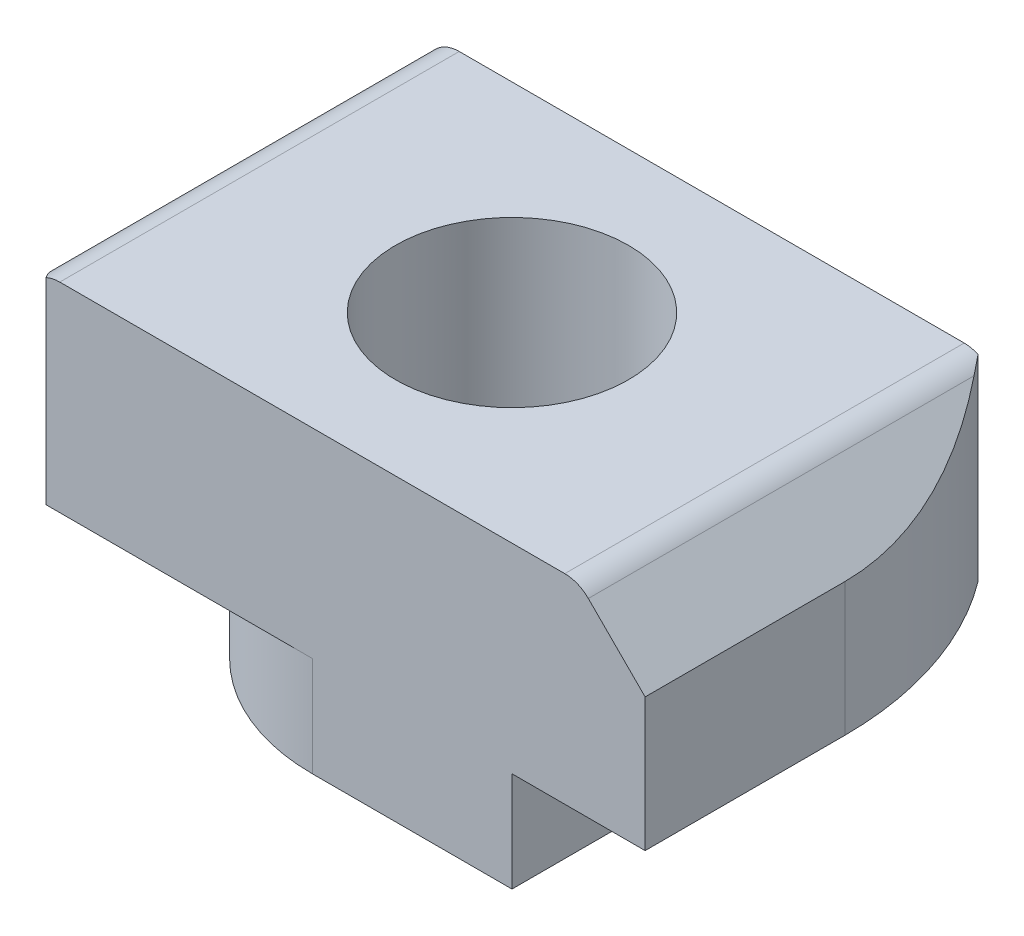
ISO-10303-21;
HEADER;
FILE_DESCRIPTION(('STEP AP214'),'2;1');
FILE_NAME('part.step','',(''),(''),'','','');
FILE_SCHEMA(('AUTOMOTIVE_DESIGN { 1 0 10303 214 1 1 1 1 }'));
ENDSEC;
DATA;
#1=APPLICATION_CONTEXT('core data for automotive mechanical design processes');
#2=APPLICATION_PROTOCOL_DEFINITION('international standard','automotive_design',2000,#1);
#3=PRODUCT_CONTEXT('',#1,'mechanical');
#4=PRODUCT('Part','Part','',(#3));
#5=PRODUCT_RELATED_PRODUCT_CATEGORY('part','',(#4));
#6=PRODUCT_DEFINITION_FORMATION('','',#4);
#7=PRODUCT_DEFINITION_CONTEXT('part definition',#1,'design');
#8=PRODUCT_DEFINITION('design','',#6,#7);
#9=PRODUCT_DEFINITION_SHAPE('','',#8);
#10=(LENGTH_UNIT() NAMED_UNIT(*) SI_UNIT(.MILLI.,.METRE.));
#11=(NAMED_UNIT(*) PLANE_ANGLE_UNIT() SI_UNIT($,.RADIAN.));
#12=(NAMED_UNIT(*) SI_UNIT($,.STERADIAN.) SOLID_ANGLE_UNIT());
#13=UNCERTAINTY_MEASURE_WITH_UNIT(LENGTH_MEASURE(1.E-05),#10,'distance_accuracy_value','');
#14=(GEOMETRIC_REPRESENTATION_CONTEXT(3) GLOBAL_UNCERTAINTY_ASSIGNED_CONTEXT((#13)) GLOBAL_UNIT_ASSIGNED_CONTEXT((#10,
#11,#12)) REPRESENTATION_CONTEXT('',''));
#15=CARTESIAN_POINT('',(0.,0.,0.));
#16=DIRECTION('',(0.,0.,1.));
#17=DIRECTION('',(1.,0.,0.));
#18=AXIS2_PLACEMENT_3D('',#15,#16,#17);
#19=CARTESIAN_POINT('',(0.,0.,-3.));
#20=DIRECTION('',(0.,-1.,0.));
#21=DIRECTION('',(0.,0.,-1.));
#22=AXIS2_PLACEMENT_3D('',#19,#20,#21);
#23=PLANE('',#22);
#24=DIRECTION('',(1.,0.,0.));
#25=VECTOR('',#24,1.);
#26=CARTESIAN_POINT('',(0.,0.,3.));
#27=LINE('',#26,#25);
#28=CARTESIAN_POINT('',(-4.,0.,3.));
#29=VERTEX_POINT('',#28);
#30=CARTESIAN_POINT('',(0.,0.,3.));
#31=VERTEX_POINT('',#30);
#32=EDGE_CURVE('E164',#29,#31,#27,.T.);
#33=ORIENTED_EDGE('',*,*,#32,.F.);
#34=CARTESIAN_POINT('',(0.,0.,0.));
#35=DIRECTION('',(0.,-1.,0.));
#36=DIRECTION('',(0.,0.,-1.));
#37=AXIS2_PLACEMENT_3D('',#34,#35,#36);
#38=CIRCLE('',#37,5.);
#39=CARTESIAN_POINT('',(-5.,0.,0.));
#40=VERTEX_POINT('',#39);
#41=EDGE_CURVE('E149',#29,#40,#38,.T.);
#42=ORIENTED_EDGE('',*,*,#41,.T.);
#43=DIRECTION('',(0.,0.,1.));
#44=VECTOR('',#43,1.);
#45=CARTESIAN_POINT('',(-5.,0.,-3.));
#46=LINE('',#45,#44);
#47=CARTESIAN_POINT('',(-5.,0.,-3.));
#48=VERTEX_POINT('',#47);
#49=EDGE_CURVE('E161',#48,#40,#46,.T.);
#50=ORIENTED_EDGE('',*,*,#49,.F.);
#51=DIRECTION('',(1.,0.,0.));
#52=VECTOR('',#51,1.);
#53=CARTESIAN_POINT('',(0.,0.,-3.));
#54=LINE('',#53,#52);
#55=CARTESIAN_POINT('',(-3.,0.,-3.));
#56=VERTEX_POINT('',#55);
#57=EDGE_CURVE('E187',#48,#56,#54,.T.);
#58=ORIENTED_EDGE('',*,*,#57,.T.);
#59=DIRECTION('',(0.,0.,-1.));
#60=VECTOR('',#59,1.);
#61=CARTESIAN_POINT('',(-3.,0.,-3.));
#62=LINE('',#61,#60);
#63=CARTESIAN_POINT('',(-3.,0.,0.));
#64=VERTEX_POINT('',#63);
#65=EDGE_CURVE('E305',#64,#56,#62,.T.);
#66=ORIENTED_EDGE('',*,*,#65,.F.);
#67=CARTESIAN_POINT('',(0.,0.,0.));
#68=DIRECTION('',(0.,-1.,0.));
#69=DIRECTION('',(0.,0.,-1.));
#70=AXIS2_PLACEMENT_3D('',#67,#68,#69);
#71=CIRCLE('',#70,3.);
#72=EDGE_CURVE('E321',#31,#64,#71,.T.);
#73=ORIENTED_EDGE('',*,*,#72,.F.);
#74=EDGE_LOOP('',(#33,#42,#50,#58,#66,#73));
#75=FACE_BOUND('',#74,.T.);
#76=ADVANCED_FACE('F35',(#75),#23,.T.);
#77=CARTESIAN_POINT('',(4.,3.,-3.));
#78=DIRECTION('',(0.707106781186548,0.707106781186547,0.));
#79=DIRECTION('',(-0.707106781186547,0.707106781186548,0.));
#80=AXIS2_PLACEMENT_3D('',#77,#78,#79);
#81=PLANE('',#80);
#82=CARTESIAN_POINT('',(0.,7.00000000000001,0.));
#83=DIRECTION('',(0.707106781186548,0.707106781186547,0.));
#84=DIRECTION('',(0.707106781186547,-0.707106781186548,0.));
#85=AXIS2_PLACEMENT_3D('',#82,#83,#84);
#86=ELLIPSE('',#85,7.07106781186548,5.);
#87=CARTESIAN_POINT('',(5.,2.,0.));
#88=VERTEX_POINT('',#87);
#89=CARTESIAN_POINT('',(4.14644660940673,2.85355339059327,-2.79409744199079));
#90=VERTEX_POINT('',#89);
#91=EDGE_CURVE('E292',#88,#90,#86,.T.);
#92=ORIENTED_EDGE('',*,*,#91,.T.);
#93=DIRECTION('',(0.,0.,1.));
#94=VECTOR('',#93,1.);
#95=CARTESIAN_POINT('',(4.14644660940673,2.85355339059327,-3.));
#96=LINE('',#95,#94);
#97=CARTESIAN_POINT('',(4.14644660940673,2.85355339059327,3.));
#98=VERTEX_POINT('',#97);
#99=EDGE_CURVE('E199',#90,#98,#96,.T.);
#100=ORIENTED_EDGE('',*,*,#99,.T.);
#101=DIRECTION('',(-0.707106781186547,0.707106781186548,0.));
#102=VECTOR('',#101,1.);
#103=CARTESIAN_POINT('',(4.,3.,3.));
#104=LINE('',#103,#102);
#105=CARTESIAN_POINT('',(5.,2.,3.));
#106=VERTEX_POINT('',#105);
#107=EDGE_CURVE('E180',#106,#98,#104,.T.);
#108=ORIENTED_EDGE('',*,*,#107,.F.);
#109=DIRECTION('',(0.,0.,1.));
#110=VECTOR('',#109,1.);
#111=CARTESIAN_POINT('',(5.,2.,-3.));
#112=LINE('',#111,#110);
#113=EDGE_CURVE('E193',#88,#106,#112,.T.);
#114=ORIENTED_EDGE('',*,*,#113,.F.);
#115=EDGE_LOOP('',(#92,#100,#108,#114));
#116=FACE_BOUND('',#115,.T.);
#117=ADVANCED_FACE('F234',(#116),#81,.T.);
#118=CARTESIAN_POINT('',(5.,0.,-3.));
#119=DIRECTION('',(1.,0.,0.));
#120=DIRECTION('',(0.,0.,-1.));
#121=AXIS2_PLACEMENT_3D('',#118,#119,#120);
#122=PLANE('',#121);
#123=DIRECTION('',(0.,0.,1.));
#124=VECTOR('',#123,1.);
#125=CARTESIAN_POINT('',(5.,0.,-3.));
#126=LINE('',#125,#124);
#127=CARTESIAN_POINT('',(5.,0.,0.));
#128=VERTEX_POINT('',#127);
#129=CARTESIAN_POINT('',(5.,0.,3.));
#130=VERTEX_POINT('',#129);
#131=EDGE_CURVE('E192',#128,#130,#126,.T.);
#132=ORIENTED_EDGE('',*,*,#131,.F.);
#133=DIRECTION('',(0.,-1.,0.));
#134=VECTOR('',#133,1.);
#135=CARTESIAN_POINT('',(5.,3.,0.));
#136=LINE('',#135,#134);
#137=EDGE_CURVE('E360',#88,#128,#136,.T.);
#138=ORIENTED_EDGE('',*,*,#137,.F.);
#139=ORIENTED_EDGE('',*,*,#113,.T.);
#140=DIRECTION('',(0.,1.,0.));
#141=VECTOR('',#140,1.);
#142=CARTESIAN_POINT('',(5.,0.,3.));
#143=LINE('',#142,#141);
#144=EDGE_CURVE('E177',#130,#106,#143,.T.);
#145=ORIENTED_EDGE('',*,*,#144,.F.);
#146=EDGE_LOOP('',(#132,#138,#139,#145));
#147=FACE_BOUND('',#146,.T.);
#148=ADVANCED_FACE('F236',(#147),#122,.T.);
#149=CARTESIAN_POINT('',(0.,0.,-3.));
#150=VERTEX_POINT('',#149);
#151=CARTESIAN_POINT('',(4.,0.,-3.));
#152=VERTEX_POINT('',#151);
#153=EDGE_CURVE('E186',#150,#152,#54,.T.);
#154=ORIENTED_EDGE('',*,*,#153,.T.);
#155=CARTESIAN_POINT('',(0.,0.,0.));
#156=DIRECTION('',(0.,-1.,0.));
#157=DIRECTION('',(0.,0.,-1.));
#158=AXIS2_PLACEMENT_3D('',#155,#156,#157);
#159=CIRCLE('',#158,5.);
#160=EDGE_CURVE('E156',#152,#128,#159,.T.);
#161=ORIENTED_EDGE('',*,*,#160,.T.);
#162=ORIENTED_EDGE('',*,*,#131,.T.);
#163=CARTESIAN_POINT('',(3.,0.,3.));
#164=VERTEX_POINT('',#163);
#165=EDGE_CURVE('E168',#164,#130,#27,.T.);
#166=ORIENTED_EDGE('',*,*,#165,.F.);
#167=DIRECTION('',(0.,0.,1.));
#168=VECTOR('',#167,1.);
#169=CARTESIAN_POINT('',(3.,0.,3.));
#170=LINE('',#169,#168);
#171=CARTESIAN_POINT('',(3.,0.,0.));
#172=VERTEX_POINT('',#171);
#173=EDGE_CURVE('E318',#172,#164,#170,.T.);
#174=ORIENTED_EDGE('',*,*,#173,.F.);
#175=CARTESIAN_POINT('',(0.,0.,0.));
#176=DIRECTION('',(0.,-1.,0.));
#177=DIRECTION('',(0.,0.,-1.));
#178=AXIS2_PLACEMENT_3D('',#175,#176,#177);
#179=CIRCLE('',#178,3.);
#180=EDGE_CURVE('E294',#150,#172,#179,.T.);
#181=ORIENTED_EDGE('',*,*,#180,.F.);
#182=EDGE_LOOP('',(#154,#161,#162,#166,#174,#181));
#183=FACE_BOUND('',#182,.T.);
#184=ADVANCED_FACE('F235',(#183),#23,.T.);
#185=CARTESIAN_POINT('',(0.,0.,-3.));
#186=DIRECTION('',(0.,0.,-1.));
#187=DIRECTION('',(-1.,0.,0.));
#188=AXIS2_PLACEMENT_3D('',#185,#186,#187);
#189=PLANE('',#188);
#190=DIRECTION('',(-1.,0.,0.));
#191=VECTOR('',#190,1.);
#192=CARTESIAN_POINT('',(0.,3.,-3.));
#193=LINE('',#192,#191);
#194=CARTESIAN_POINT('',(3.79289321881345,3.,-3.));
#195=VERTEX_POINT('',#194);
#196=CARTESIAN_POINT('',(-3.79289321881345,3.,-3.));
#197=VERTEX_POINT('',#196);
#198=EDGE_CURVE('E189',#195,#197,#193,.T.);
#199=ORIENTED_EDGE('',*,*,#198,.F.);
#200=CARTESIAN_POINT('',(3.79289321881345,2.5,-3.));
#201=DIRECTION('',(0.,0.,-1.));
#202=DIRECTION('',(-1.,0.,0.));
#203=AXIS2_PLACEMENT_3D('',#200,#201,#202);
#204=CIRCLE('',#203,0.5);
#205=CARTESIAN_POINT('',(4.,2.95508986056223,-3.));
#206=VERTEX_POINT('',#205);
#207=EDGE_CURVE('E213',#195,#206,#204,.T.);
#208=ORIENTED_EDGE('',*,*,#207,.T.);
#209=DIRECTION('',(0.,-1.,0.));
#210=VECTOR('',#209,1.);
#211=CARTESIAN_POINT('',(4.,3.,-3.));
#212=LINE('',#211,#210);
#213=EDGE_CURVE('E197',#206,#152,#212,.T.);
#214=ORIENTED_EDGE('',*,*,#213,.T.);
#215=ORIENTED_EDGE('',*,*,#153,.F.);
#216=DIRECTION('',(0.,1.,0.));
#217=VECTOR('',#216,1.);
#218=CARTESIAN_POINT('',(0.,-1.5,-3.));
#219=LINE('',#218,#217);
#220=CARTESIAN_POINT('',(0.,-1.5,-3.));
#221=VERTEX_POINT('',#220);
#222=EDGE_CURVE('E315',#221,#150,#219,.T.);
#223=ORIENTED_EDGE('',*,*,#222,.F.);
#224=DIRECTION('',(1.,0.,0.));
#225=VECTOR('',#224,1.);
#226=CARTESIAN_POINT('',(0.,-1.5,-3.));
#227=LINE('',#226,#225);
#228=CARTESIAN_POINT('',(-3.,-1.5,-3.));
#229=VERTEX_POINT('',#228);
#230=EDGE_CURVE('E313',#229,#221,#227,.T.);
#231=ORIENTED_EDGE('',*,*,#230,.F.);
#232=DIRECTION('',(0.,1.,0.));
#233=VECTOR('',#232,1.);
#234=CARTESIAN_POINT('',(-3.,-1.5,-3.));
#235=LINE('',#234,#233);
#236=EDGE_CURVE('E328',#229,#56,#235,.T.);
#237=ORIENTED_EDGE('',*,*,#236,.T.);
#238=ORIENTED_EDGE('',*,*,#57,.F.);
#239=DIRECTION('',(0.,1.,0.));
#240=VECTOR('',#239,1.);
#241=CARTESIAN_POINT('',(-5.,0.,-3.));
#242=LINE('',#241,#240);
#243=CARTESIAN_POINT('',(-5.,2.,-3.));
#244=VERTEX_POINT('',#243);
#245=EDGE_CURVE('E167',#48,#244,#242,.T.);
#246=ORIENTED_EDGE('',*,*,#245,.T.);
#247=DIRECTION('',(0.707106781186547,0.707106781186548,0.));
#248=VECTOR('',#247,1.);
#249=CARTESIAN_POINT('',(-4.,3.,-3.));
#250=LINE('',#249,#248);
#251=CARTESIAN_POINT('',(-4.14644660940673,2.85355339059327,-3.));
#252=VERTEX_POINT('',#251);
#253=EDGE_CURVE('E342',#244,#252,#250,.T.);
#254=ORIENTED_EDGE('',*,*,#253,.T.);
#255=CARTESIAN_POINT('',(-3.79289321881345,2.5,-3.));
#256=DIRECTION('',(0.,0.,-1.));
#257=DIRECTION('',(-1.,0.,0.));
#258=AXIS2_PLACEMENT_3D('',#255,#256,#257);
#259=CIRCLE('',#258,0.5);
#260=EDGE_CURVE('E211',#252,#197,#259,.T.);
#261=ORIENTED_EDGE('',*,*,#260,.T.);
#262=EDGE_LOOP('',(#199,#208,#214,#215,#223,#231,#237,#238,#246,#254,#261));
#263=FACE_BOUND('',#262,.T.);
#264=ADVANCED_FACE('F249',(#263),#189,.T.);
#265=CARTESIAN_POINT('',(0.,0.,3.));
#266=DIRECTION('',(0.,0.,-1.));
#267=DIRECTION('',(-1.,0.,0.));
#268=AXIS2_PLACEMENT_3D('',#265,#266,#267);
#269=PLANE('',#268);
#270=ORIENTED_EDGE('',*,*,#107,.T.);
#271=CARTESIAN_POINT('',(3.79289321881345,2.5,3.));
#272=DIRECTION('',(0.,0.,-1.));
#273=DIRECTION('',(-1.,0.,0.));
#274=AXIS2_PLACEMENT_3D('',#271,#272,#273);
#275=CIRCLE('',#274,0.5);
#276=CARTESIAN_POINT('',(3.79289321881345,3.,3.));
#277=VERTEX_POINT('',#276);
#278=EDGE_CURVE('E204',#98,#277,#275,.F.);
#279=ORIENTED_EDGE('',*,*,#278,.T.);
#280=DIRECTION('',(-1.,0.,0.));
#281=VECTOR('',#280,1.);
#282=CARTESIAN_POINT('',(0.,3.,3.));
#283=LINE('',#282,#281);
#284=CARTESIAN_POINT('',(-3.79289321881345,3.,3.));
#285=VERTEX_POINT('',#284);
#286=EDGE_CURVE('E183',#277,#285,#283,.T.);
#287=ORIENTED_EDGE('',*,*,#286,.T.);
#288=CARTESIAN_POINT('',(-3.79289321881345,2.5,3.));
#289=DIRECTION('',(0.,0.,-1.));
#290=DIRECTION('',(-1.,0.,0.));
#291=AXIS2_PLACEMENT_3D('',#288,#289,#290);
#292=CIRCLE('',#291,0.5);
#293=CARTESIAN_POINT('',(-4.,2.95508986056223,3.));
#294=VERTEX_POINT('',#293);
#295=EDGE_CURVE('E202',#285,#294,#292,.F.);
#296=ORIENTED_EDGE('',*,*,#295,.T.);
#297=DIRECTION('',(0.,-1.,0.));
#298=VECTOR('',#297,1.);
#299=CARTESIAN_POINT('',(-4.,3.,3.));
#300=LINE('',#299,#298);
#301=EDGE_CURVE('E297',#29,#294,#300,.F.);
#302=ORIENTED_EDGE('',*,*,#301,.F.);
#303=ORIENTED_EDGE('',*,*,#32,.T.);
#304=DIRECTION('',(0.,1.,0.));
#305=VECTOR('',#304,1.);
#306=CARTESIAN_POINT('',(0.,-1.5,3.));
#307=LINE('',#306,#305);
#308=CARTESIAN_POINT('',(0.,-1.5,3.));
#309=VERTEX_POINT('',#308);
#310=EDGE_CURVE('E334',#309,#31,#307,.T.);
#311=ORIENTED_EDGE('',*,*,#310,.F.);
#312=DIRECTION('',(-1.,0.,0.));
#313=VECTOR('',#312,1.);
#314=CARTESIAN_POINT('',(0.,-1.5,3.));
#315=LINE('',#314,#313);
#316=CARTESIAN_POINT('',(3.,-1.5,3.));
#317=VERTEX_POINT('',#316);
#318=EDGE_CURVE('E307',#317,#309,#315,.T.);
#319=ORIENTED_EDGE('',*,*,#318,.F.);
#320=DIRECTION('',(0.,1.,0.));
#321=VECTOR('',#320,1.);
#322=CARTESIAN_POINT('',(3.,-1.5,3.));
#323=LINE('',#322,#321);
#324=EDGE_CURVE('E337',#317,#164,#323,.T.);
#325=ORIENTED_EDGE('',*,*,#324,.T.);
#326=ORIENTED_EDGE('',*,*,#165,.T.);
#327=ORIENTED_EDGE('',*,*,#144,.T.);
#328=EDGE_LOOP('',(#270,#279,#287,#296,#302,#303,#311,#319,#325,#326,#327));
#329=FACE_BOUND('',#328,.T.);
#330=ADVANCED_FACE('F252',(#329),#269,.F.);
#331=CARTESIAN_POINT('',(-5.,0.,-3.));
#332=DIRECTION('',(1.,0.,0.));
#333=DIRECTION('',(0.,0.,-1.));
#334=AXIS2_PLACEMENT_3D('',#331,#332,#333);
#335=PLANE('',#334);
#336=DIRECTION('',(0.,-1.,0.));
#337=VECTOR('',#336,1.);
#338=CARTESIAN_POINT('',(-5.,3.,0.));
#339=LINE('',#338,#337);
#340=CARTESIAN_POINT('',(-5.,2.,0.));
#341=VERTEX_POINT('',#340);
#342=EDGE_CURVE('E146',#341,#40,#339,.T.);
#343=ORIENTED_EDGE('',*,*,#342,.F.);
#344=DIRECTION('',(0.,0.,1.));
#345=VECTOR('',#344,1.);
#346=CARTESIAN_POINT('',(-5.,2.,-3.));
#347=LINE('',#346,#345);
#348=EDGE_CURVE('E169',#244,#341,#347,.T.);
#349=ORIENTED_EDGE('',*,*,#348,.F.);
#350=ORIENTED_EDGE('',*,*,#245,.F.);
#351=ORIENTED_EDGE('',*,*,#49,.T.);
#352=EDGE_LOOP('',(#343,#349,#350,#351));
#353=FACE_BOUND('',#352,.T.);
#354=ADVANCED_FACE('F166',(#353),#335,.F.);
#355=CARTESIAN_POINT('',(-4.,3.,-3.));
#356=DIRECTION('',(0.707106781186548,-0.707106781186547,0.));
#357=DIRECTION('',(0.707106781186547,0.707106781186548,0.));
#358=AXIS2_PLACEMENT_3D('',#355,#356,#357);
#359=PLANE('',#358);
#360=CARTESIAN_POINT('',(0.,7.00000000000001,0.));
#361=DIRECTION('',(0.707106781186548,-0.707106781186547,0.));
#362=DIRECTION('',(-0.707106781186547,-0.707106781186548,0.));
#363=AXIS2_PLACEMENT_3D('',#360,#361,#362);
#364=ELLIPSE('',#363,7.07106781186548,5.);
#365=CARTESIAN_POINT('',(-4.14644660940673,2.85355339059327,2.79409744199079));
#366=VERTEX_POINT('',#365);
#367=EDGE_CURVE('E151',#366,#341,#364,.T.);
#368=ORIENTED_EDGE('',*,*,#367,.F.);
#369=DIRECTION('',(0.,0.,1.));
#370=VECTOR('',#369,1.);
#371=CARTESIAN_POINT('',(-4.14644660940673,2.85355339059327,-3.));
#372=LINE('',#371,#370);
#373=EDGE_CURVE('E11',#366,#252,#372,.F.);
#374=ORIENTED_EDGE('',*,*,#373,.T.);
#375=ORIENTED_EDGE('',*,*,#253,.F.);
#376=ORIENTED_EDGE('',*,*,#348,.T.);
#377=EDGE_LOOP('',(#368,#374,#375,#376));
#378=FACE_BOUND('',#377,.T.);
#379=ADVANCED_FACE('F247',(#378),#359,.F.);
#380=CARTESIAN_POINT('',(0.,3.,-3.));
#381=DIRECTION('',(0.,1.,0.));
#382=DIRECTION('',(-1.,0.,0.));
#383=AXIS2_PLACEMENT_3D('',#380,#381,#382);
#384=PLANE('',#383);
#385=CARTESIAN_POINT('',(0.,3.,0.));
#386=DIRECTION('',(0.,-1.,0.));
#387=DIRECTION('',(0.,0.,-1.));
#388=AXIS2_PLACEMENT_3D('',#385,#386,#387);
#389=CIRCLE('',#388,1.75);
#390=CARTESIAN_POINT('',(0.,3.,-1.75));
#391=VERTEX_POINT('',#390);
#392=EDGE_CURVE('E291',#391,#391,#389,.T.);
#393=ORIENTED_EDGE('',*,*,#392,.T.);
#394=EDGE_LOOP('',(#393));
#395=FACE_BOUND('',#394,.T.);
#396=ORIENTED_EDGE('',*,*,#286,.F.);
#397=DIRECTION('',(0.,0.,1.));
#398=VECTOR('',#397,1.);
#399=CARTESIAN_POINT('',(3.79289321881345,3.,-3.));
#400=LINE('',#399,#398);
#401=EDGE_CURVE('E209',#277,#195,#400,.F.);
#402=ORIENTED_EDGE('',*,*,#401,.T.);
#403=ORIENTED_EDGE('',*,*,#198,.T.);
#404=DIRECTION('',(0.,0.,1.));
#405=VECTOR('',#404,1.);
#406=CARTESIAN_POINT('',(-3.79289321881345,3.,3.));
#407=LINE('',#406,#405);
#408=EDGE_CURVE('E206',#197,#285,#407,.T.);
#409=ORIENTED_EDGE('',*,*,#408,.T.);
#410=EDGE_LOOP('',(#396,#402,#403,#409));
#411=FACE_BOUND('',#410,.T.);
#412=ADVANCED_FACE('F243',(#395,#411),#384,.T.);
#413=CARTESIAN_POINT('',(0.,-1.5,0.));
#414=DIRECTION('',(0.,-1.,0.));
#415=DIRECTION('',(0.,0.,-1.));
#416=AXIS2_PLACEMENT_3D('',#413,#414,#415);
#417=PLANE('',#416);
#418=CARTESIAN_POINT('',(0.,-1.5,0.));
#419=DIRECTION('',(0.,-1.,0.));
#420=DIRECTION('',(0.,0.,-1.));
#421=AXIS2_PLACEMENT_3D('',#418,#419,#420);
#422=CIRCLE('',#421,3.);
#423=CARTESIAN_POINT('',(3.,-1.5,0.));
#424=VERTEX_POINT('',#423);
#425=EDGE_CURVE('E301',#221,#424,#422,.T.);
#426=ORIENTED_EDGE('',*,*,#425,.T.);
#427=DIRECTION('',(0.,0.,1.));
#428=VECTOR('',#427,1.);
#429=CARTESIAN_POINT('',(3.,-1.5,3.));
#430=LINE('',#429,#428);
#431=EDGE_CURVE('E304',#424,#317,#430,.T.);
#432=ORIENTED_EDGE('',*,*,#431,.T.);
#433=ORIENTED_EDGE('',*,*,#318,.T.);
#434=CARTESIAN_POINT('',(0.,-1.5,0.));
#435=DIRECTION('',(0.,-1.,0.));
#436=DIRECTION('',(0.,0.,-1.));
#437=AXIS2_PLACEMENT_3D('',#434,#435,#436);
#438=CIRCLE('',#437,3.);
#439=CARTESIAN_POINT('',(-3.,-1.5,0.));
#440=VERTEX_POINT('',#439);
#441=EDGE_CURVE('E309',#309,#440,#438,.T.);
#442=ORIENTED_EDGE('',*,*,#441,.T.);
#443=DIRECTION('',(0.,0.,-1.));
#444=VECTOR('',#443,1.);
#445=CARTESIAN_POINT('',(-3.,-1.5,-3.));
#446=LINE('',#445,#444);
#447=EDGE_CURVE('E311',#440,#229,#446,.T.);
#448=ORIENTED_EDGE('',*,*,#447,.T.);
#449=ORIENTED_EDGE('',*,*,#230,.T.);
#450=EDGE_LOOP('',(#426,#432,#433,#442,#448,#449));
#451=FACE_BOUND('',#450,.T.);
#452=CARTESIAN_POINT('',(0.,-1.5,0.));
#453=DIRECTION('',(0.,-1.,0.));
#454=DIRECTION('',(0.,0.,-1.));
#455=AXIS2_PLACEMENT_3D('',#452,#453,#454);
#456=CIRCLE('',#455,1.75);
#457=CARTESIAN_POINT('',(0.,-1.5,-1.75));
#458=VERTEX_POINT('',#457);
#459=EDGE_CURVE('E288',#458,#458,#456,.T.);
#460=ORIENTED_EDGE('',*,*,#459,.F.);
#461=EDGE_LOOP('',(#460));
#462=FACE_BOUND('',#461,.T.);
#463=ADVANCED_FACE('F246',(#451,#462),#417,.T.);
#464=CARTESIAN_POINT('',(0.,-1.5,0.));
#465=DIRECTION('',(0.,1.,0.));
#466=DIRECTION('',(0.,0.,1.));
#467=AXIS2_PLACEMENT_3D('',#464,#465,#466);
#468=CYLINDRICAL_SURFACE('',#467,3.);
#469=ORIENTED_EDGE('',*,*,#180,.T.);
#470=DIRECTION('',(0.,1.,0.));
#471=VECTOR('',#470,1.);
#472=CARTESIAN_POINT('',(3.,-1.5,0.));
#473=LINE('',#472,#471);
#474=EDGE_CURVE('E340',#424,#172,#473,.T.);
#475=ORIENTED_EDGE('',*,*,#474,.F.);
#476=ORIENTED_EDGE('',*,*,#425,.F.);
#477=ORIENTED_EDGE('',*,*,#222,.T.);
#478=EDGE_LOOP('',(#469,#475,#476,#477));
#479=FACE_BOUND('',#478,.T.);
#480=ADVANCED_FACE('F261',(#479),#468,.T.);
#481=CARTESIAN_POINT('',(3.,-1.5,3.));
#482=DIRECTION('',(-1.,0.,0.));
#483=DIRECTION('',(0.,0.,1.));
#484=AXIS2_PLACEMENT_3D('',#481,#482,#483);
#485=PLANE('',#484);
#486=ORIENTED_EDGE('',*,*,#173,.T.);
#487=ORIENTED_EDGE('',*,*,#324,.F.);
#488=ORIENTED_EDGE('',*,*,#431,.F.);
#489=ORIENTED_EDGE('',*,*,#474,.T.);
#490=EDGE_LOOP('',(#486,#487,#488,#489));
#491=FACE_BOUND('',#490,.T.);
#492=ADVANCED_FACE('F264',(#491),#485,.F.);
#493=CARTESIAN_POINT('',(0.,-1.5,0.));
#494=DIRECTION('',(0.,1.,0.));
#495=DIRECTION('',(0.,0.,1.));
#496=AXIS2_PLACEMENT_3D('',#493,#494,#495);
#497=CYLINDRICAL_SURFACE('',#496,3.);
#498=ORIENTED_EDGE('',*,*,#72,.T.);
#499=DIRECTION('',(0.,1.,0.));
#500=VECTOR('',#499,1.);
#501=CARTESIAN_POINT('',(-3.,-1.5,0.));
#502=LINE('',#501,#500);
#503=EDGE_CURVE('E331',#440,#64,#502,.T.);
#504=ORIENTED_EDGE('',*,*,#503,.F.);
#505=ORIENTED_EDGE('',*,*,#441,.F.);
#506=ORIENTED_EDGE('',*,*,#310,.T.);
#507=EDGE_LOOP('',(#498,#504,#505,#506));
#508=FACE_BOUND('',#507,.T.);
#509=ADVANCED_FACE('F268',(#508),#497,.T.);
#510=CARTESIAN_POINT('',(-3.,-1.5,-3.));
#511=DIRECTION('',(1.,0.,0.));
#512=DIRECTION('',(0.,0.,-1.));
#513=AXIS2_PLACEMENT_3D('',#510,#511,#512);
#514=PLANE('',#513);
#515=ORIENTED_EDGE('',*,*,#65,.T.);
#516=ORIENTED_EDGE('',*,*,#236,.F.);
#517=ORIENTED_EDGE('',*,*,#447,.F.);
#518=ORIENTED_EDGE('',*,*,#503,.T.);
#519=EDGE_LOOP('',(#515,#516,#517,#518));
#520=FACE_BOUND('',#519,.T.);
#521=ADVANCED_FACE('F272',(#520),#514,.F.);
#522=CARTESIAN_POINT('',(0.,-1.5,0.));
#523=DIRECTION('',(0.,1.,0.));
#524=DIRECTION('',(0.,0.,1.));
#525=AXIS2_PLACEMENT_3D('',#522,#523,#524);
#526=CYLINDRICAL_SURFACE('',#525,1.75);
#527=ORIENTED_EDGE('',*,*,#459,.T.);
#528=EDGE_LOOP('',(#527));
#529=FACE_BOUND('',#528,.T.);
#530=ORIENTED_EDGE('',*,*,#392,.F.);
#531=EDGE_LOOP('',(#530));
#532=FACE_BOUND('',#531,.T.);
#533=ADVANCED_FACE('F276',(#529,#532),#526,.F.);
#534=CARTESIAN_POINT('',(0.,3.,0.));
#535=DIRECTION('',(0.,-1.,0.));
#536=DIRECTION('',(0.,0.,-1.));
#537=AXIS2_PLACEMENT_3D('',#534,#535,#536);
#538=CYLINDRICAL_SURFACE('',#537,5.);
#539=ORIENTED_EDGE('',*,*,#301,.T.);
#540=CARTESIAN_POINT('',(-4.,2.95508986056223,3.));
#541=CARTESIAN_POINT('',(-4.01319009137007,2.94908301094322,2.98241436500424));
#542=CARTESIAN_POINT('',(-4.02616865438521,2.94248841650761,2.96486678680057));
#543=CARTESIAN_POINT('',(-4.05161257269987,2.92810972463043,2.92999966339588));
#544=CARTESIAN_POINT('',(-4.06407966529355,2.92033016649448,2.91267951093106));
#545=CARTESIAN_POINT('',(-4.08851132091617,2.90352212838899,2.87828415770374));
#546=CARTESIAN_POINT('',(-4.10047581891129,2.89449348743792,2.86120898882825));
#547=CARTESIAN_POINT('',(-4.12388263723468,2.87506857464967,2.82736974509923));
#548=CARTESIAN_POINT('',(-4.13532282778605,2.86466729402535,2.81060707937946));
#549=CARTESIAN_POINT('',(-4.14644660940673,2.85355339059327,2.79409744199078));
#550=B_SPLINE_CURVE_WITH_KNOTS('',3,(#540,#541,#542,#543,#544,#545,#546,#547,#548,#549),
.UNSPECIFIED.,.F.,.F.,(4,2,2,2,4),(0.,0.0683611117038497,0.136466645455068,0.204580964824564,
0.272951086856512),.UNSPECIFIED.);
#551=EDGE_CURVE('E44',#294,#366,#550,.T.);
#552=ORIENTED_EDGE('',*,*,#551,.T.);
#553=ORIENTED_EDGE('',*,*,#367,.T.);
#554=ORIENTED_EDGE('',*,*,#342,.T.);
#555=ORIENTED_EDGE('',*,*,#41,.F.);
#556=EDGE_LOOP('',(#539,#552,#553,#554,#555));
#557=FACE_BOUND('',#556,.T.);
#558=ADVANCED_FACE('F148',(#557),#538,.T.);
#559=CARTESIAN_POINT('',(0.,3.,0.));
#560=DIRECTION('',(0.,-1.,0.));
#561=DIRECTION('',(0.,0.,-1.));
#562=AXIS2_PLACEMENT_3D('',#559,#560,#561);
#563=CYLINDRICAL_SURFACE('',#562,5.);
#564=ORIENTED_EDGE('',*,*,#213,.F.);
#565=CARTESIAN_POINT('',(4.,2.95508986056223,-3.));
#566=CARTESIAN_POINT('',(4.01319009137007,2.94908301094322,-2.98241436500424));
#567=CARTESIAN_POINT('',(4.02616865438521,2.94248841650761,-2.96486678680057));
#568=CARTESIAN_POINT('',(4.05161257269987,2.92810972463043,-2.92999966339588));
#569=CARTESIAN_POINT('',(4.06407966529355,2.92033016649448,-2.91267951093106));
#570=CARTESIAN_POINT('',(4.08851132091617,2.903522128389,-2.87828415770374));
#571=CARTESIAN_POINT('',(4.10047581891129,2.89449348743792,-2.86120898882825));
#572=CARTESIAN_POINT('',(4.12388263723468,2.87506857464967,-2.82736974509923));
#573=CARTESIAN_POINT('',(4.13532282778604,2.86466729402535,-2.81060707937946));
#574=CARTESIAN_POINT('',(4.14644660940673,2.85355339059328,-2.79409744199079));
#575=B_SPLINE_CURVE_WITH_KNOTS('',3,(#565,#566,#567,#568,#569,#570,#571,#572,#573,#574),
.UNSPECIFIED.,.F.,.F.,(4,2,2,2,4),(0.,0.0683611117038492,0.136466645455066,0.204580964824563,
0.272951086856509),.UNSPECIFIED.);
#576=EDGE_CURVE('E215',#206,#90,#575,.T.);
#577=ORIENTED_EDGE('',*,*,#576,.T.);
#578=ORIENTED_EDGE('',*,*,#91,.F.);
#579=ORIENTED_EDGE('',*,*,#137,.T.);
#580=ORIENTED_EDGE('',*,*,#160,.F.);
#581=EDGE_LOOP('',(#564,#577,#578,#579,#580));
#582=FACE_BOUND('',#581,.T.);
#583=ADVANCED_FACE('F224',(#582),#563,.T.);
#584=CARTESIAN_POINT('',(3.79289321881345,2.5,-3.));
#585=DIRECTION('',(0.,0.,1.));
#586=DIRECTION('',(1.,0.,0.));
#587=AXIS2_PLACEMENT_3D('',#584,#585,#586);
#588=CYLINDRICAL_SURFACE('',#587,0.5);
#589=ORIENTED_EDGE('',*,*,#207,.F.);
#590=ORIENTED_EDGE('',*,*,#401,.F.);
#591=ORIENTED_EDGE('',*,*,#278,.F.);
#592=ORIENTED_EDGE('',*,*,#99,.F.);
#593=ORIENTED_EDGE('',*,*,#576,.F.);
#594=EDGE_LOOP('',(#589,#590,#591,#592,#593));
#595=FACE_BOUND('',#594,.T.);
#596=ADVANCED_FACE('F227',(#595),#588,.T.);
#597=CARTESIAN_POINT('',(-3.79289321881345,2.5,-3.));
#598=DIRECTION('',(0.,0.,-1.));
#599=DIRECTION('',(-1.,0.,0.));
#600=AXIS2_PLACEMENT_3D('',#597,#598,#599);
#601=CYLINDRICAL_SURFACE('',#600,0.5);
#602=ORIENTED_EDGE('',*,*,#260,.F.);
#603=ORIENTED_EDGE('',*,*,#373,.F.);
#604=ORIENTED_EDGE('',*,*,#551,.F.);
#605=ORIENTED_EDGE('',*,*,#295,.F.);
#606=ORIENTED_EDGE('',*,*,#408,.F.);
#607=EDGE_LOOP('',(#602,#603,#604,#605,#606));
#608=FACE_BOUND('',#607,.T.);
#609=ADVANCED_FACE('F37',(#608),#601,.T.);
#610=CLOSED_SHELL('',(#76,#117,#148,#184,#264,#330,#354,#379,#412,#463,#480,#492,#509,#521,#533,
#558,#583,#596,#609));
#611=MANIFOLD_SOLID_BREP('B2',#610);
#612=ADVANCED_BREP_SHAPE_REPRESENTATION('',(#18,#611),#14);
#613=SHAPE_DEFINITION_REPRESENTATION(#9,#612);
ENDSEC;
END-ISO-10303-21;
